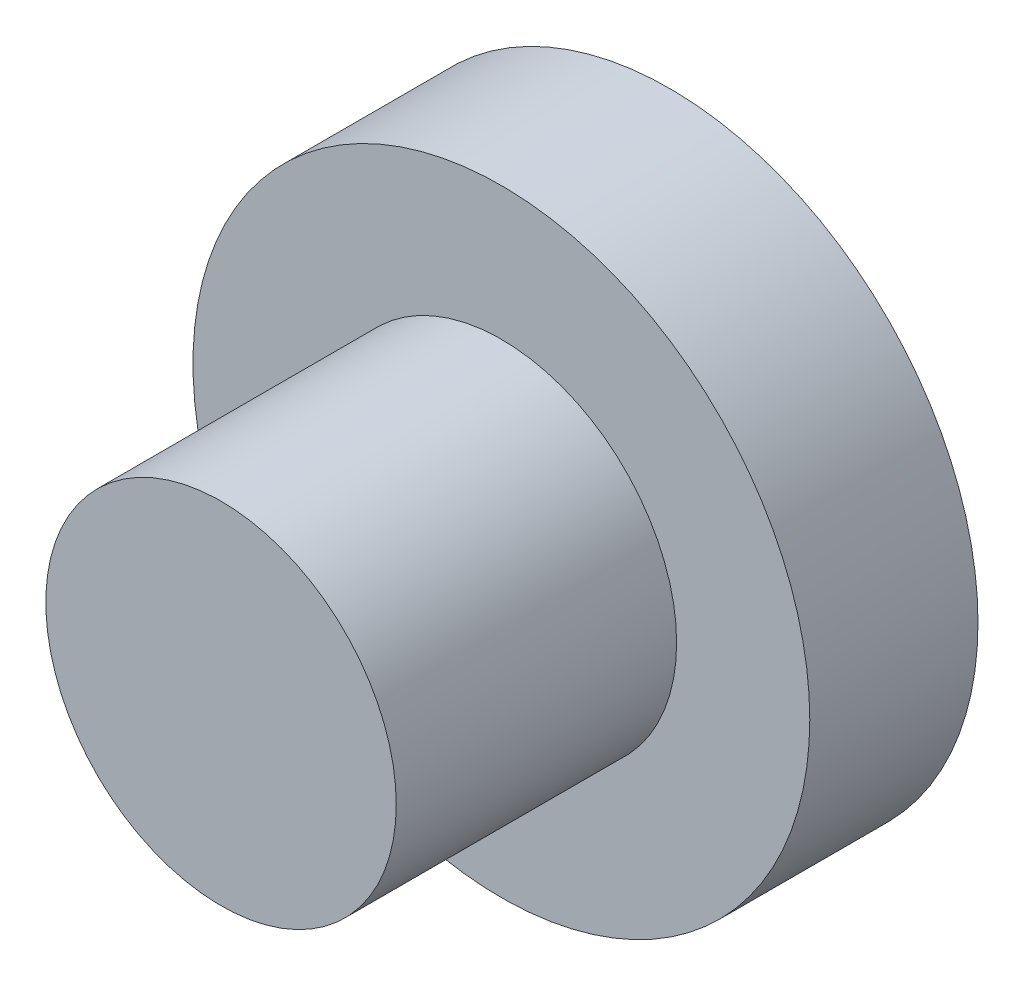
ISO-10303-21;
HEADER;
FILE_DESCRIPTION(('STEP AP214'),'2;1');
FILE_NAME('part.step','',(''),(''),'','','');
FILE_SCHEMA(('AUTOMOTIVE_DESIGN { 1 0 10303 214 1 1 1 1 }'));
ENDSEC;
DATA;
#1=APPLICATION_CONTEXT('core data for automotive mechanical design processes');
#2=APPLICATION_PROTOCOL_DEFINITION('international standard','automotive_design',2000,#1);
#3=PRODUCT_CONTEXT('',#1,'mechanical');
#4=PRODUCT('Part','Part','',(#3));
#5=PRODUCT_RELATED_PRODUCT_CATEGORY('part','',(#4));
#6=PRODUCT_DEFINITION_FORMATION('','',#4);
#7=PRODUCT_DEFINITION_CONTEXT('part definition',#1,'design');
#8=PRODUCT_DEFINITION('design','',#6,#7);
#9=PRODUCT_DEFINITION_SHAPE('','',#8);
#10=(LENGTH_UNIT() NAMED_UNIT(*) SI_UNIT(.MILLI.,.METRE.));
#11=(NAMED_UNIT(*) PLANE_ANGLE_UNIT() SI_UNIT($,.RADIAN.));
#12=(NAMED_UNIT(*) SI_UNIT($,.STERADIAN.) SOLID_ANGLE_UNIT());
#13=UNCERTAINTY_MEASURE_WITH_UNIT(LENGTH_MEASURE(1.E-05),#10,'distance_accuracy_value','');
#14=(GEOMETRIC_REPRESENTATION_CONTEXT(3) GLOBAL_UNCERTAINTY_ASSIGNED_CONTEXT((#13)) GLOBAL_UNIT_ASSIGNED_CONTEXT((#10,
#11,#12)) REPRESENTATION_CONTEXT('',''));
#15=CARTESIAN_POINT('',(0.,0.,0.));
#16=DIRECTION('',(0.,0.,1.));
#17=DIRECTION('',(1.,0.,0.));
#18=AXIS2_PLACEMENT_3D('',#15,#16,#17);
#19=CARTESIAN_POINT('',(0.,0.,12.));
#20=DIRECTION('',(0.,0.,-1.));
#21=DIRECTION('',(-1.,0.,0.));
#22=AXIS2_PLACEMENT_3D('',#19,#20,#21);
#23=CYLINDRICAL_SURFACE('',#22,22.);
#24=CARTESIAN_POINT('',(0.,0.,12.));
#25=DIRECTION('',(0.,0.,1.));
#26=DIRECTION('',(1.,0.,0.));
#27=AXIS2_PLACEMENT_3D('',#24,#25,#26);
#28=CIRCLE('',#27,22.);
#29=CARTESIAN_POINT('',(22.,0.,12.));
#30=VERTEX_POINT('',#29);
#31=EDGE_CURVE('E42',#30,#30,#28,.T.);
#32=ORIENTED_EDGE('',*,*,#31,.F.);
#33=EDGE_LOOP('',(#32));
#34=FACE_BOUND('',#33,.T.);
#35=CARTESIAN_POINT('',(0.,0.,0.));
#36=DIRECTION('',(0.,0.,1.));
#37=DIRECTION('',(1.,0.,0.));
#38=AXIS2_PLACEMENT_3D('',#35,#36,#37);
#39=CIRCLE('',#38,22.);
#40=CARTESIAN_POINT('',(22.,0.,0.));
#41=VERTEX_POINT('',#40);
#42=EDGE_CURVE('E38',#41,#41,#39,.T.);
#43=ORIENTED_EDGE('',*,*,#42,.T.);
#44=EDGE_LOOP('',(#43));
#45=FACE_BOUND('',#44,.T.);
#46=ADVANCED_FACE('F35',(#34,#45),#23,.T.);
#47=CARTESIAN_POINT('',(0.,0.,12.));
#48=DIRECTION('',(0.,0.,1.));
#49=DIRECTION('',(1.,0.,0.));
#50=AXIS2_PLACEMENT_3D('',#47,#48,#49);
#51=PLANE('',#50);
#52=CARTESIAN_POINT('',(0.,0.,12.));
#53=DIRECTION('',(0.,0.,1.));
#54=DIRECTION('',(1.,0.,0.));
#55=AXIS2_PLACEMENT_3D('',#52,#53,#54);
#56=CIRCLE('',#55,12.5);
#57=CARTESIAN_POINT('',(12.5,0.,12.));
#58=VERTEX_POINT('',#57);
#59=EDGE_CURVE('E10',#58,#58,#56,.T.);
#60=ORIENTED_EDGE('',*,*,#59,.F.);
#61=EDGE_LOOP('',(#60));
#62=FACE_BOUND('',#61,.T.);
#63=ORIENTED_EDGE('',*,*,#31,.T.);
#64=EDGE_LOOP('',(#63));
#65=FACE_BOUND('',#64,.T.);
#66=ADVANCED_FACE('F59',(#62,#65),#51,.T.);
#67=CARTESIAN_POINT('',(0.,0.,0.));
#68=DIRECTION('',(0.,0.,1.));
#69=DIRECTION('',(1.,0.,0.));
#70=AXIS2_PLACEMENT_3D('',#67,#68,#69);
#71=PLANE('',#70);
#72=ORIENTED_EDGE('',*,*,#42,.F.);
#73=EDGE_LOOP('',(#72));
#74=FACE_BOUND('',#73,.T.);
#75=ADVANCED_FACE('F56',(#74),#71,.F.);
#76=CARTESIAN_POINT('',(0.,0.,32.));
#77=DIRECTION('',(0.,0.,-1.));
#78=DIRECTION('',(-1.,0.,0.));
#79=AXIS2_PLACEMENT_3D('',#76,#77,#78);
#80=CYLINDRICAL_SURFACE('',#79,12.5);
#81=CARTESIAN_POINT('',(0.,0.,32.));
#82=DIRECTION('',(0.,0.,1.));
#83=DIRECTION('',(1.,0.,0.));
#84=AXIS2_PLACEMENT_3D('',#81,#82,#83);
#85=CIRCLE('',#84,12.5);
#86=CARTESIAN_POINT('',(12.5,0.,32.));
#87=VERTEX_POINT('',#86);
#88=EDGE_CURVE('E48',#87,#87,#85,.T.);
#89=ORIENTED_EDGE('',*,*,#88,.F.);
#90=EDGE_LOOP('',(#89));
#91=FACE_BOUND('',#90,.T.);
#92=ORIENTED_EDGE('',*,*,#59,.T.);
#93=EDGE_LOOP('',(#92));
#94=FACE_BOUND('',#93,.T.);
#95=ADVANCED_FACE('F58',(#91,#94),#80,.T.);
#96=CARTESIAN_POINT('',(0.,0.,32.));
#97=DIRECTION('',(0.,0.,1.));
#98=DIRECTION('',(1.,0.,0.));
#99=AXIS2_PLACEMENT_3D('',#96,#97,#98);
#100=PLANE('',#99);
#101=ORIENTED_EDGE('',*,*,#88,.T.);
#102=EDGE_LOOP('',(#101));
#103=FACE_BOUND('',#102,.T.);
#104=ADVANCED_FACE('F64',(#103),#100,.T.);
#105=CLOSED_SHELL('',(#46,#66,#75,#95,#104));
#106=MANIFOLD_SOLID_BREP('B2',#105);
#107=ADVANCED_BREP_SHAPE_REPRESENTATION('',(#18,#106),#14);
#108=SHAPE_DEFINITION_REPRESENTATION(#9,#107);
ENDSEC;
END-ISO-10303-21;
